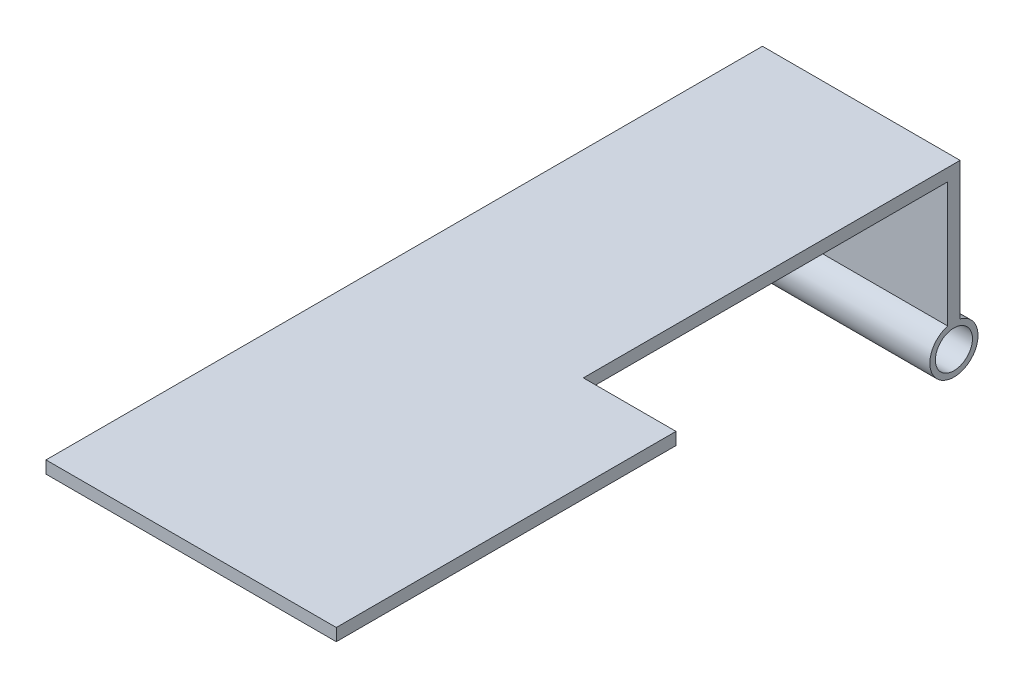
ISO-10303-21;
HEADER;
FILE_DESCRIPTION(('STEP AP214'),'2;1');
FILE_NAME('part.step','',(''),(''),'','','');
FILE_SCHEMA(('AUTOMOTIVE_DESIGN { 1 0 10303 214 1 1 1 1 }'));
ENDSEC;
DATA;
#1=APPLICATION_CONTEXT('core data for automotive mechanical design processes');
#2=APPLICATION_PROTOCOL_DEFINITION('international standard','automotive_design',2000,#1);
#3=PRODUCT_CONTEXT('',#1,'mechanical');
#4=PRODUCT('Part','Part','',(#3));
#5=PRODUCT_RELATED_PRODUCT_CATEGORY('part','',(#4));
#6=PRODUCT_DEFINITION_FORMATION('','',#4);
#7=PRODUCT_DEFINITION_CONTEXT('part definition',#1,'design');
#8=PRODUCT_DEFINITION('design','',#6,#7);
#9=PRODUCT_DEFINITION_SHAPE('','',#8);
#10=(LENGTH_UNIT() NAMED_UNIT(*) SI_UNIT(.MILLI.,.METRE.));
#11=(NAMED_UNIT(*) PLANE_ANGLE_UNIT() SI_UNIT($,.RADIAN.));
#12=(NAMED_UNIT(*) SI_UNIT($,.STERADIAN.) SOLID_ANGLE_UNIT());
#13=UNCERTAINTY_MEASURE_WITH_UNIT(LENGTH_MEASURE(1.E-05),#10,'distance_accuracy_value','');
#14=(GEOMETRIC_REPRESENTATION_CONTEXT(3) GLOBAL_UNCERTAINTY_ASSIGNED_CONTEXT((#13)) GLOBAL_UNIT_ASSIGNED_CONTEXT((#10,
#11,#12)) REPRESENTATION_CONTEXT('',''));
#15=CARTESIAN_POINT('',(0.,0.,0.));
#16=DIRECTION('',(0.,0.,1.));
#17=DIRECTION('',(1.,0.,0.));
#18=AXIS2_PLACEMENT_3D('',#15,#16,#17);
#19=CARTESIAN_POINT('',(16.,0.,0.500534490034143));
#20=DIRECTION('',(0.,0.,-1.));
#21=DIRECTION('',(-1.,0.,0.));
#22=AXIS2_PLACEMENT_3D('',#19,#20,#21);
#23=PLANE('',#22);
#24=DIRECTION('',(0.,-1.,0.));
#25=VECTOR('',#24,1.);
#26=CARTESIAN_POINT('',(16.,0.,0.500534490034143));
#27=LINE('',#26,#25);
#28=CARTESIAN_POINT('',(16.,12.,0.500534490034143));
#29=VERTEX_POINT('',#28);
#30=CARTESIAN_POINT('',(16.,1.88466581236204,0.500534490034143));
#31=VERTEX_POINT('',#30);
#32=EDGE_CURVE('E48',#29,#31,#27,.T.);
#33=ORIENTED_EDGE('',*,*,#32,.F.);
#34=DIRECTION('',(-1.,0.,0.));
#35=VECTOR('',#34,1.);
#36=CARTESIAN_POINT('',(16.,12.,0.500534490034143));
#37=LINE('',#36,#35);
#38=CARTESIAN_POINT('',(0.,12.,0.500534490034143));
#39=VERTEX_POINT('',#38);
#40=EDGE_CURVE('E52',#29,#39,#37,.T.);
#41=ORIENTED_EDGE('',*,*,#40,.T.);
#42=DIRECTION('',(0.,-1.,0.));
#43=VECTOR('',#42,1.);
#44=CARTESIAN_POINT('',(0.,0.,0.500534490034143));
#45=LINE('',#44,#43);
#46=CARTESIAN_POINT('',(0.,1.88466581236204,0.500534490034143));
#47=VERTEX_POINT('',#46);
#48=EDGE_CURVE('E103',#39,#47,#45,.T.);
#49=ORIENTED_EDGE('',*,*,#48,.T.);
#50=DIRECTION('',(-1.,0.,0.));
#51=VECTOR('',#50,1.);
#52=CARTESIAN_POINT('',(16.,1.88466581236204,0.500534490034143));
#53=LINE('',#52,#51);
#54=EDGE_CURVE('E11',#31,#47,#53,.T.);
#55=ORIENTED_EDGE('',*,*,#54,.F.);
#56=EDGE_LOOP('',(#33,#41,#49,#55));
#57=FACE_BOUND('',#56,.T.);
#58=ADVANCED_FACE('F33',(#57),#23,.F.);
#59=CARTESIAN_POINT('',(16.,0.,0.));
#60=DIRECTION('',(-1.,0.,0.));
#61=DIRECTION('',(0.,0.,1.));
#62=AXIS2_PLACEMENT_3D('',#59,#60,#61);
#63=CYLINDRICAL_SURFACE('',#62,1.95);
#64=CARTESIAN_POINT('',(0.,0.,0.));
#65=DIRECTION('',(1.,0.,0.));
#66=DIRECTION('',(0.,0.,-1.));
#67=AXIS2_PLACEMENT_3D('',#64,#65,#66);
#68=CIRCLE('',#67,1.95);
#69=CARTESIAN_POINT('',(0.,1.88494939039608,-0.499465509965857));
#70=VERTEX_POINT('',#69);
#71=EDGE_CURVE('E160',#47,#70,#68,.T.);
#72=ORIENTED_EDGE('',*,*,#71,.T.);
#73=DIRECTION('',(-1.,0.,0.));
#74=VECTOR('',#73,1.);
#75=CARTESIAN_POINT('',(16.,1.88494939039608,-0.499465509965857));
#76=LINE('',#75,#74);
#77=CARTESIAN_POINT('',(16.,1.88494939039608,-0.499465509965857));
#78=VERTEX_POINT('',#77);
#79=EDGE_CURVE('E41',#78,#70,#76,.T.);
#80=ORIENTED_EDGE('',*,*,#79,.F.);
#81=CARTESIAN_POINT('',(16.,0.,0.));
#82=DIRECTION('',(1.,0.,0.));
#83=DIRECTION('',(0.,0.,-1.));
#84=AXIS2_PLACEMENT_3D('',#81,#82,#83);
#85=CIRCLE('',#84,1.95);
#86=EDGE_CURVE('E149',#31,#78,#85,.T.);
#87=ORIENTED_EDGE('',*,*,#86,.F.);
#88=ORIENTED_EDGE('',*,*,#54,.T.);
#89=EDGE_LOOP('',(#72,#80,#87,#88));
#90=FACE_BOUND('',#89,.T.);
#91=ADVANCED_FACE('F176',(#90),#63,.T.);
#92=CARTESIAN_POINT('',(16.,0.,-0.499465509965857));
#93=DIRECTION('',(0.,0.,-1.));
#94=DIRECTION('',(-1.,0.,0.));
#95=AXIS2_PLACEMENT_3D('',#92,#93,#94);
#96=PLANE('',#95);
#97=DIRECTION('',(0.,-1.,0.));
#98=VECTOR('',#97,1.);
#99=CARTESIAN_POINT('',(0.,0.,-0.499465509965857));
#100=LINE('',#99,#98);
#101=CARTESIAN_POINT('',(0.,13.,-0.499465509965857));
#102=VERTEX_POINT('',#101);
#103=EDGE_CURVE('E163',#102,#70,#100,.T.);
#104=ORIENTED_EDGE('',*,*,#103,.F.);
#105=DIRECTION('',(-1.,0.,0.));
#106=VECTOR('',#105,1.);
#107=CARTESIAN_POINT('',(16.,13.,-0.499465509965857));
#108=LINE('',#107,#106);
#109=CARTESIAN_POINT('',(16.,13.,-0.499465509965857));
#110=VERTEX_POINT('',#109);
#111=EDGE_CURVE('E156',#110,#102,#108,.T.);
#112=ORIENTED_EDGE('',*,*,#111,.F.);
#113=DIRECTION('',(0.,-1.,0.));
#114=VECTOR('',#113,1.);
#115=CARTESIAN_POINT('',(16.,0.,-0.499465509965857));
#116=LINE('',#115,#114);
#117=EDGE_CURVE('E151',#110,#78,#116,.T.);
#118=ORIENTED_EDGE('',*,*,#117,.T.);
#119=ORIENTED_EDGE('',*,*,#79,.T.);
#120=EDGE_LOOP('',(#104,#112,#118,#119));
#121=FACE_BOUND('',#120,.T.);
#122=ADVANCED_FACE('F171',(#121),#96,.T.);
#123=CARTESIAN_POINT('',(16.,0.,0.));
#124=DIRECTION('',(-1.,0.,0.));
#125=DIRECTION('',(0.,0.,1.));
#126=AXIS2_PLACEMENT_3D('',#123,#124,#125);
#127=CYLINDRICAL_SURFACE('',#126,1.5);
#128=CARTESIAN_POINT('',(16.,0.,0.));
#129=DIRECTION('',(1.,0.,0.));
#130=DIRECTION('',(0.,0.,-1.));
#131=AXIS2_PLACEMENT_3D('',#128,#129,#130);
#132=CIRCLE('',#131,1.5);
#133=CARTESIAN_POINT('',(16.,0.,-1.5));
#134=VERTEX_POINT('',#133);
#135=EDGE_CURVE('E144',#134,#134,#132,.T.);
#136=ORIENTED_EDGE('',*,*,#135,.T.);
#137=EDGE_LOOP('',(#136));
#138=FACE_BOUND('',#137,.T.);
#139=CARTESIAN_POINT('',(0.,0.,0.));
#140=DIRECTION('',(1.,0.,0.));
#141=DIRECTION('',(0.,0.,-1.));
#142=AXIS2_PLACEMENT_3D('',#139,#140,#141);
#143=CIRCLE('',#142,1.5);
#144=CARTESIAN_POINT('',(0.,0.,-1.5));
#145=VERTEX_POINT('',#144);
#146=EDGE_CURVE('E143',#145,#145,#143,.T.);
#147=ORIENTED_EDGE('',*,*,#146,.F.);
#148=EDGE_LOOP('',(#147));
#149=FACE_BOUND('',#148,.T.);
#150=ADVANCED_FACE('F35',(#138,#149),#127,.F.);
#151=CARTESIAN_POINT('',(16.,13.,0.));
#152=DIRECTION('',(0.,1.,0.));
#153=DIRECTION('',(0.,0.,1.));
#154=AXIS2_PLACEMENT_3D('',#151,#152,#153);
#155=PLANE('',#154);
#156=ORIENTED_EDGE('',*,*,#111,.T.);
#157=DIRECTION('',(0.,0.,-1.));
#158=VECTOR('',#157,1.);
#159=CARTESIAN_POINT('',(0.,13.,0.));
#160=LINE('',#159,#158);
#161=CARTESIAN_POINT('',(0.,13.,57.5));
#162=VERTEX_POINT('',#161);
#163=EDGE_CURVE('E147',#162,#102,#160,.T.);
#164=ORIENTED_EDGE('',*,*,#163,.F.);
#165=DIRECTION('',(1.,0.,0.));
#166=VECTOR('',#165,1.);
#167=CARTESIAN_POINT('',(0.,13.,57.5));
#168=LINE('',#167,#166);
#169=CARTESIAN_POINT('',(23.5,13.,57.5));
#170=VERTEX_POINT('',#169);
#171=EDGE_CURVE('E113',#162,#170,#168,.T.);
#172=ORIENTED_EDGE('',*,*,#171,.T.);
#173=DIRECTION('',(0.,0.,-1.));
#174=VECTOR('',#173,1.);
#175=CARTESIAN_POINT('',(23.5,13.,30.0005344900341));
#176=LINE('',#175,#174);
#177=CARTESIAN_POINT('',(23.5,13.,30.0005344900341));
#178=VERTEX_POINT('',#177);
#179=EDGE_CURVE('E131',#170,#178,#176,.T.);
#180=ORIENTED_EDGE('',*,*,#179,.T.);
#181=DIRECTION('',(-1.,0.,0.));
#182=VECTOR('',#181,1.);
#183=CARTESIAN_POINT('',(16.,13.,30.0005344900341));
#184=LINE('',#183,#182);
#185=CARTESIAN_POINT('',(16.,13.,30.0005344900341));
#186=VERTEX_POINT('',#185);
#187=EDGE_CURVE('E107',#178,#186,#184,.T.);
#188=ORIENTED_EDGE('',*,*,#187,.T.);
#189=DIRECTION('',(0.,0.,-1.));
#190=VECTOR('',#189,1.);
#191=CARTESIAN_POINT('',(16.,13.,0.));
#192=LINE('',#191,#190);
#193=EDGE_CURVE('E154',#186,#110,#192,.T.);
#194=ORIENTED_EDGE('',*,*,#193,.T.);
#195=EDGE_LOOP('',(#156,#164,#172,#180,#188,#194));
#196=FACE_BOUND('',#195,.T.);
#197=ADVANCED_FACE('F178',(#196),#155,.T.);
#198=CARTESIAN_POINT('',(16.,0.,0.));
#199=DIRECTION('',(1.,0.,0.));
#200=DIRECTION('',(0.,0.,-1.));
#201=AXIS2_PLACEMENT_3D('',#198,#199,#200);
#202=PLANE('',#201);
#203=ORIENTED_EDGE('',*,*,#117,.F.);
#204=ORIENTED_EDGE('',*,*,#193,.F.);
#205=DIRECTION('',(0.,1.,0.));
#206=VECTOR('',#205,1.);
#207=CARTESIAN_POINT('',(16.,12.,30.0005344900341));
#208=LINE('',#207,#206);
#209=CARTESIAN_POINT('',(16.,12.,30.0005344900341));
#210=VERTEX_POINT('',#209);
#211=EDGE_CURVE('E136',#210,#186,#208,.T.);
#212=ORIENTED_EDGE('',*,*,#211,.F.);
#213=DIRECTION('',(0.,0.,-1.));
#214=VECTOR('',#213,1.);
#215=CARTESIAN_POINT('',(16.,12.,0.000534490034142989));
#216=LINE('',#215,#214);
#217=EDGE_CURVE('E115',#210,#29,#216,.T.);
#218=ORIENTED_EDGE('',*,*,#217,.T.);
#219=ORIENTED_EDGE('',*,*,#32,.T.);
#220=ORIENTED_EDGE('',*,*,#86,.T.);
#221=EDGE_LOOP('',(#203,#204,#212,#218,#219,#220));
#222=FACE_BOUND('',#221,.T.);
#223=ORIENTED_EDGE('',*,*,#135,.F.);
#224=EDGE_LOOP('',(#223));
#225=FACE_BOUND('',#224,.T.);
#226=ADVANCED_FACE('F180',(#222,#225),#202,.T.);
#227=CARTESIAN_POINT('',(0.,0.,0.));
#228=DIRECTION('',(1.,0.,0.));
#229=DIRECTION('',(0.,0.,-1.));
#230=AXIS2_PLACEMENT_3D('',#227,#228,#229);
#231=PLANE('',#230);
#232=ORIENTED_EDGE('',*,*,#163,.T.);
#233=ORIENTED_EDGE('',*,*,#103,.T.);
#234=ORIENTED_EDGE('',*,*,#71,.F.);
#235=ORIENTED_EDGE('',*,*,#48,.F.);
#236=DIRECTION('',(0.,0.,1.));
#237=VECTOR('',#236,1.);
#238=CARTESIAN_POINT('',(0.,12.,0.));
#239=LINE('',#238,#237);
#240=CARTESIAN_POINT('',(0.,12.,57.5));
#241=VERTEX_POINT('',#240);
#242=EDGE_CURVE('E96',#39,#241,#239,.T.);
#243=ORIENTED_EDGE('',*,*,#242,.T.);
#244=DIRECTION('',(0.,1.,0.));
#245=VECTOR('',#244,1.);
#246=CARTESIAN_POINT('',(0.,12.,57.5));
#247=LINE('',#246,#245);
#248=EDGE_CURVE('E100',#241,#162,#247,.T.);
#249=ORIENTED_EDGE('',*,*,#248,.T.);
#250=EDGE_LOOP('',(#232,#233,#234,#235,#243,#249));
#251=FACE_BOUND('',#250,.T.);
#252=ORIENTED_EDGE('',*,*,#146,.T.);
#253=EDGE_LOOP('',(#252));
#254=FACE_BOUND('',#253,.T.);
#255=ADVANCED_FACE('F98',(#251,#254),#231,.F.);
#256=CARTESIAN_POINT('',(0.,12.,0.));
#257=DIRECTION('',(0.,-1.,0.));
#258=DIRECTION('',(0.,0.,-1.));
#259=AXIS2_PLACEMENT_3D('',#256,#257,#258);
#260=PLANE('',#259);
#261=ORIENTED_EDGE('',*,*,#40,.F.);
#262=ORIENTED_EDGE('',*,*,#217,.F.);
#263=DIRECTION('',(-1.,0.,0.));
#264=VECTOR('',#263,1.);
#265=CARTESIAN_POINT('',(16.,12.,30.0005344900341));
#266=LINE('',#265,#264);
#267=CARTESIAN_POINT('',(23.5,12.,30.0005344900341));
#268=VERTEX_POINT('',#267);
#269=EDGE_CURVE('E123',#268,#210,#266,.T.);
#270=ORIENTED_EDGE('',*,*,#269,.F.);
#271=DIRECTION('',(0.,0.,-1.));
#272=VECTOR('',#271,1.);
#273=CARTESIAN_POINT('',(23.5,12.,30.0005344900341));
#274=LINE('',#273,#272);
#275=CARTESIAN_POINT('',(23.5,12.,57.5));
#276=VERTEX_POINT('',#275);
#277=EDGE_CURVE('E121',#276,#268,#274,.T.);
#278=ORIENTED_EDGE('',*,*,#277,.F.);
#279=DIRECTION('',(1.,0.,0.));
#280=VECTOR('',#279,1.);
#281=CARTESIAN_POINT('',(0.,12.,57.5));
#282=LINE('',#281,#280);
#283=EDGE_CURVE('E106',#241,#276,#282,.T.);
#284=ORIENTED_EDGE('',*,*,#283,.F.);
#285=ORIENTED_EDGE('',*,*,#242,.F.);
#286=EDGE_LOOP('',(#261,#262,#270,#278,#284,#285));
#287=FACE_BOUND('',#286,.T.);
#288=ADVANCED_FACE('F118',(#287),#260,.T.);
#289=CARTESIAN_POINT('',(16.,12.,30.0005344900341));
#290=DIRECTION('',(0.,0.,-1.));
#291=DIRECTION('',(-1.,0.,0.));
#292=AXIS2_PLACEMENT_3D('',#289,#290,#291);
#293=PLANE('',#292);
#294=ORIENTED_EDGE('',*,*,#187,.F.);
#295=DIRECTION('',(0.,1.,0.));
#296=VECTOR('',#295,1.);
#297=CARTESIAN_POINT('',(23.5,12.,30.0005344900341));
#298=LINE('',#297,#296);
#299=EDGE_CURVE('E139',#268,#178,#298,.T.);
#300=ORIENTED_EDGE('',*,*,#299,.F.);
#301=ORIENTED_EDGE('',*,*,#269,.T.);
#302=ORIENTED_EDGE('',*,*,#211,.T.);
#303=EDGE_LOOP('',(#294,#300,#301,#302));
#304=FACE_BOUND('',#303,.T.);
#305=ADVANCED_FACE('F201',(#304),#293,.T.);
#306=CARTESIAN_POINT('',(23.5,12.,30.0005344900341));
#307=DIRECTION('',(1.,0.,0.));
#308=DIRECTION('',(0.,0.,-1.));
#309=AXIS2_PLACEMENT_3D('',#306,#307,#308);
#310=PLANE('',#309);
#311=ORIENTED_EDGE('',*,*,#179,.F.);
#312=DIRECTION('',(0.,1.,0.));
#313=VECTOR('',#312,1.);
#314=CARTESIAN_POINT('',(23.5,12.,57.5));
#315=LINE('',#314,#313);
#316=EDGE_CURVE('E114',#276,#170,#315,.T.);
#317=ORIENTED_EDGE('',*,*,#316,.F.);
#318=ORIENTED_EDGE('',*,*,#277,.T.);
#319=ORIENTED_EDGE('',*,*,#299,.T.);
#320=EDGE_LOOP('',(#311,#317,#318,#319));
#321=FACE_BOUND('',#320,.T.);
#322=ADVANCED_FACE('F198',(#321),#310,.T.);
#323=CARTESIAN_POINT('',(0.,12.,57.5));
#324=DIRECTION('',(0.,0.,1.));
#325=DIRECTION('',(1.,0.,0.));
#326=AXIS2_PLACEMENT_3D('',#323,#324,#325);
#327=PLANE('',#326);
#328=ORIENTED_EDGE('',*,*,#171,.F.);
#329=ORIENTED_EDGE('',*,*,#248,.F.);
#330=ORIENTED_EDGE('',*,*,#283,.T.);
#331=ORIENTED_EDGE('',*,*,#316,.T.);
#332=EDGE_LOOP('',(#328,#329,#330,#331));
#333=FACE_BOUND('',#332,.T.);
#334=ADVANCED_FACE('F111',(#333),#327,.T.);
#335=CLOSED_SHELL('',(#58,#91,#122,#150,#197,#226,#255,#288,#305,#322,#334));
#336=MANIFOLD_SOLID_BREP('B2',#335);
#337=ADVANCED_BREP_SHAPE_REPRESENTATION('',(#18,#336),#14);
#338=SHAPE_DEFINITION_REPRESENTATION(#9,#337);
ENDSEC;
END-ISO-10303-21;
